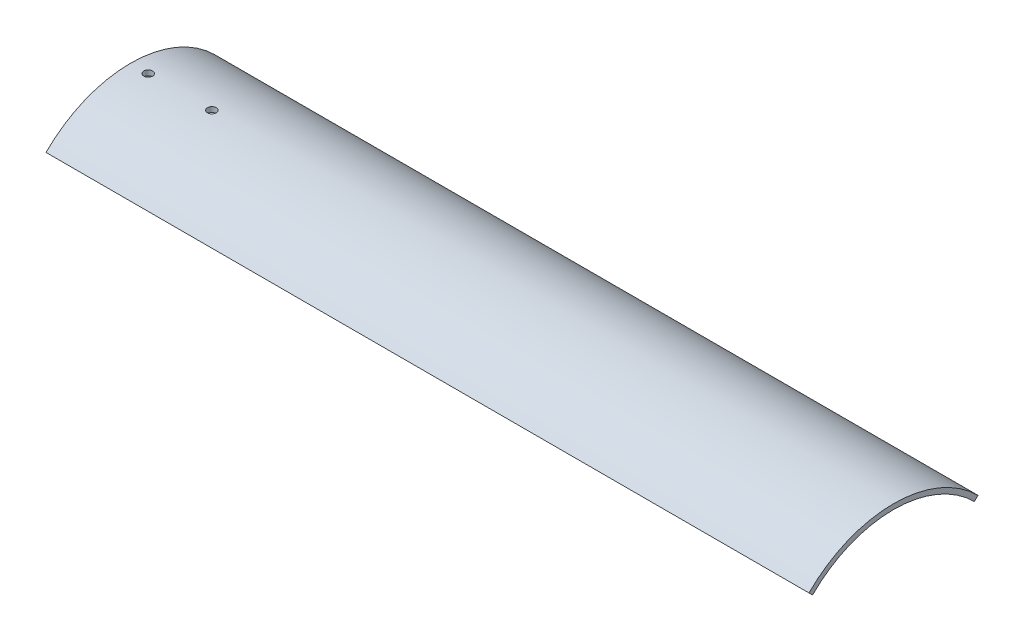
ISO-10303-21;
HEADER;
FILE_DESCRIPTION(('STEP AP214'),'2;1');
FILE_NAME('part.step','',(''),(''),'','','');
FILE_SCHEMA(('AUTOMOTIVE_DESIGN { 1 0 10303 214 1 1 1 1 }'));
ENDSEC;
DATA;
#1=APPLICATION_CONTEXT('core data for automotive mechanical design processes');
#2=APPLICATION_PROTOCOL_DEFINITION('international standard','automotive_design',2000,#1);
#3=PRODUCT_CONTEXT('',#1,'mechanical');
#4=PRODUCT('Part','Part','',(#3));
#5=PRODUCT_RELATED_PRODUCT_CATEGORY('part','',(#4));
#6=PRODUCT_DEFINITION_FORMATION('','',#4);
#7=PRODUCT_DEFINITION_CONTEXT('part definition',#1,'design');
#8=PRODUCT_DEFINITION('design','',#6,#7);
#9=PRODUCT_DEFINITION_SHAPE('','',#8);
#10=(LENGTH_UNIT() NAMED_UNIT(*) SI_UNIT(.MILLI.,.METRE.));
#11=(NAMED_UNIT(*) PLANE_ANGLE_UNIT() SI_UNIT($,.RADIAN.));
#12=(NAMED_UNIT(*) SI_UNIT($,.STERADIAN.) SOLID_ANGLE_UNIT());
#13=UNCERTAINTY_MEASURE_WITH_UNIT(LENGTH_MEASURE(1.E-05),#10,'distance_accuracy_value','');
#14=(GEOMETRIC_REPRESENTATION_CONTEXT(3) GLOBAL_UNCERTAINTY_ASSIGNED_CONTEXT((#13)) GLOBAL_UNIT_ASSIGNED_CONTEXT((#10,
#11,#12)) REPRESENTATION_CONTEXT('',''));
#15=CARTESIAN_POINT('',(0.,0.,0.));
#16=DIRECTION('',(0.,0.,1.));
#17=DIRECTION('',(1.,0.,0.));
#18=AXIS2_PLACEMENT_3D('',#15,#16,#17);
#19=CARTESIAN_POINT('',(300.,0.,0.));
#20=DIRECTION('',(-1.,0.,0.));
#21=DIRECTION('',(0.,0.,1.));
#22=AXIS2_PLACEMENT_3D('',#19,#20,#21);
#23=CYLINDRICAL_SURFACE('',#22,45.);
#24=CARTESIAN_POINT('',(0.,0.,0.));
#25=DIRECTION('',(-1.,0.,0.));
#26=DIRECTION('',(0.,0.,-1.));
#27=AXIS2_PLACEMENT_3D('',#24,#25,#26);
#28=CIRCLE('',#27,45.);
#29=CARTESIAN_POINT('',(0.,31.8198051533945,31.8198051533948));
#30=VERTEX_POINT('',#29);
#31=CARTESIAN_POINT('',(0.,31.8198051533947,-31.8198051533945));
#32=VERTEX_POINT('',#31);
#33=EDGE_CURVE('E119',#30,#32,#28,.T.);
#34=ORIENTED_EDGE('',*,*,#33,.T.);
#35=DIRECTION('',(-1.,0.,0.));
#36=VECTOR('',#35,1.);
#37=CARTESIAN_POINT('',(300.,31.8198051533947,-31.8198051533946));
#38=LINE('',#37,#36);
#39=CARTESIAN_POINT('',(300.,31.8198051533947,-31.8198051533946));
#40=VERTEX_POINT('',#39);
#41=EDGE_CURVE('E106',#40,#32,#38,.T.);
#42=ORIENTED_EDGE('',*,*,#41,.F.);
#43=CARTESIAN_POINT('',(300.,0.,0.));
#44=DIRECTION('',(-1.,0.,0.));
#45=DIRECTION('',(0.,0.,-1.));
#46=AXIS2_PLACEMENT_3D('',#43,#44,#45);
#47=CIRCLE('',#46,45.);
#48=CARTESIAN_POINT('',(300.,31.8198051533945,31.8198051533947));
#49=VERTEX_POINT('',#48);
#50=EDGE_CURVE('E98',#49,#40,#47,.T.);
#51=ORIENTED_EDGE('',*,*,#50,.F.);
#52=DIRECTION('',(-1.,0.,0.));
#53=VECTOR('',#52,1.);
#54=CARTESIAN_POINT('',(300.,31.8198051533945,31.8198051533947));
#55=LINE('',#54,#53);
#56=EDGE_CURVE('E115',#49,#30,#55,.T.);
#57=ORIENTED_EDGE('',*,*,#56,.T.);
#58=EDGE_LOOP('',(#34,#42,#51,#57));
#59=FACE_BOUND('',#58,.T.);
#60=CARTESIAN_POINT('',(6.99999999999996,44.9659593470438,-1.74999999999997));
#61=CARTESIAN_POINT('',(7.09825838396686,44.9659598055857,-1.74999565495516));
#62=CARTESIAN_POINT('',(7.19658706853365,44.9662848747568,-1.74169675016469));
#63=CARTESIAN_POINT('',(7.39053367823565,44.9675503086713,-1.7087074677497));
#64=CARTESIAN_POINT('',(7.48614824126109,44.9684914045432,-1.68399761235469));
#65=CARTESIAN_POINT('',(7.67182891684091,44.9708821261737,-1.6188933800893));
#66=CARTESIAN_POINT('',(7.7618977616683,44.9723314991183,-1.5785067996637));
#67=CARTESIAN_POINT('',(7.93395258700272,44.9755751380676,-1.48320703325454));
#68=CARTESIAN_POINT('',(8.01594050912741,44.9773693209171,-1.42829734849969));
#69=CARTESIAN_POINT('',(8.16958591821743,44.9811017963171,-1.30546822996094));
#70=CARTESIAN_POINT('',(8.24123741561034,44.9830401714436,-1.23754130582705));
#71=CARTESIAN_POINT('',(8.3721252763947,44.9868418145214,-1.0906200803457));
#72=CARTESIAN_POINT('',(8.43136114067798,44.9887050794508,-1.01162533428496));
#73=CARTESIAN_POINT('',(8.53574970957215,44.9921470324911,-0.844783350008693));
#74=CARTESIAN_POINT('',(8.58089820578592,44.993725635504,-0.756933476801994));
#75=CARTESIAN_POINT('',(8.65580329141312,44.9964195837585,-0.574893620846356));
#76=CARTESIAN_POINT('',(8.68555996347752,44.9975349314877,-0.480703672145398));
#77=CARTESIAN_POINT('',(8.7288221508429,44.999176148571,-0.288708298088724));
#78=CARTESIAN_POINT('',(8.74233595338404,44.9997023185189,-0.190904742701436));
#79=CARTESIAN_POINT('',(8.75275434973569,45.0001068825402,0.00558401250816508));
#80=CARTESIAN_POINT('',(8.74965903448749,44.9999852801603,0.104269207500209));
#81=CARTESIAN_POINT('',(8.72695398943664,44.9991082603587,0.299663812484741));
#82=CARTESIAN_POINT('',(8.70735319024055,44.99835318569,0.396374261973394));
#83=CARTESIAN_POINT('',(8.65220740164322,44.9962946961243,0.585131025563077));
#84=CARTESIAN_POINT('',(8.61666236495413,44.9949912796011,0.677177325830141));
#85=CARTESIAN_POINT('',(8.53062687022684,44.9919823862289,0.85402170462127));
#86=CARTESIAN_POINT('',(8.48013232835791,44.9902767995431,0.938817794401062));
#87=CARTESIAN_POINT('',(8.36563418381595,44.986655727893,1.0987329309039));
#88=CARTESIAN_POINT('',(8.301630525562,44.984740242065,1.17385193781021));
#89=CARTESIAN_POINT('',(8.16188045375559,44.9809136840786,1.31233262069461));
#90=CARTESIAN_POINT('',(8.08612629272578,44.9790026156825,1.37568647854551));
#91=CARTESIAN_POINT('',(7.92505287855395,44.9754016215129,1.48877827791612));
#92=CARTESIAN_POINT('',(7.83973362352616,44.973711695783,1.53851621675143));
#93=CARTESIAN_POINT('',(7.66194739804559,44.9707436413353,1.62296351740035));
#94=CARTESIAN_POINT('',(7.56948029966539,44.9694655199897,1.65767261016412));
#95=CARTESIAN_POINT('',(7.38002523408606,44.9674654970992,1.711071850518));
#96=CARTESIAN_POINT('',(7.2830372874924,44.9667435930193,1.72976207111263));
#97=CARTESIAN_POINT('',(7.08736171067596,44.9659378715661,1.75058339827295));
#98=CARTESIAN_POINT('',(6.98867523546335,44.9658536365183,1.75272534400956));
#99=CARTESIAN_POINT('',(6.79234416207666,44.9663316617354,1.74041758117208));
#100=CARTESIAN_POINT('',(6.69469956184028,44.9668939207204,1.72596790544549));
#101=CARTESIAN_POINT('',(6.50325433219873,44.968601174145,1.68089605496893));
#102=CARTESIAN_POINT('',(6.40945253817957,44.9697459905998,1.65027881967516));
#103=CARTESIAN_POINT('',(6.22831980351561,44.9724891617772,1.57374596418586));
#104=CARTESIAN_POINT('',(6.14098888527319,44.9740875180699,1.52783029102967));
#105=CARTESIAN_POINT('',(5.97522700045581,44.9775586179304,1.42197604387523));
#106=CARTESIAN_POINT('',(5.89680069427478,44.9794315040147,1.36203017669828));
#107=CARTESIAN_POINT('',(5.75112110661805,44.9832400429249,1.22982787213181));
#108=CARTESIAN_POINT('',(5.68386787004977,44.9851756960031,1.15757138526514));
#109=CARTESIAN_POINT('',(5.56240721997545,44.9888927952384,1.00275246149325));
#110=CARTESIAN_POINT('',(5.5082068000026,44.990674158403,0.92018453566584));
#111=CARTESIAN_POINT('',(5.41443813456942,44.9938807063187,0.747114418116953));
#112=CARTESIAN_POINT('',(5.37486984432861,44.9953058921599,0.65661225067865));
#113=CARTESIAN_POINT('',(5.31150089804462,44.997639047213,0.470268907124216));
#114=CARTESIAN_POINT('',(5.28769573346567,44.9985471643054,0.374429266130424));
#115=CARTESIAN_POINT('',(5.25651400471212,44.9997444102247,0.180109881536486));
#116=CARTESIAN_POINT('',(5.24913739619947,45.0000335407222,0.0816301450622629));
#117=CARTESIAN_POINT('',(5.25102268108969,44.9999602341898,-0.115104307476514));
#118=CARTESIAN_POINT('',(5.2602735804137,44.9995982276905,-0.21335912924743));
#119=CARTESIAN_POINT('',(5.29512861533844,44.9982642693349,-0.406919813624855));
#120=CARTESIAN_POINT('',(5.32073278280743,44.99729231629,-0.502225670484222));
#121=CARTESIAN_POINT('',(5.3875655997709,44.9948478934991,-0.687186142921089));
#122=CARTESIAN_POINT('',(5.42879446823192,44.9933754167387,-0.776840679279731));
#123=CARTESIAN_POINT('',(5.52570374596455,44.9900957384232,-0.947954633992117));
#124=CARTESIAN_POINT('',(5.581383662935,44.9882885482713,-1.02941433138675));
#125=CARTESIAN_POINT('',(5.70565130285219,44.9845416800131,-1.18187957188539));
#126=CARTESIAN_POINT('',(5.7742461578773,44.982601929081,-1.25287929982889));
#127=CARTESIAN_POINT('',(5.92240179084603,44.9788088573197,-1.38237577847034));
#128=CARTESIAN_POINT('',(6.00196527320123,44.9769555579572,-1.44086943658578));
#129=CARTESIAN_POINT('',(6.16984273095774,44.9735435289108,-1.54370993722767));
#130=CARTESIAN_POINT('',(6.25816336701889,44.9719850261086,-1.58804590160247));
#131=CARTESIAN_POINT('',(6.4409333974421,44.9693422336031,-1.66120798358385));
#132=CARTESIAN_POINT('',(6.53537535944727,44.9682573807495,-1.69005252929878));
#133=CARTESIAN_POINT('',(6.69200849559711,44.9669731649923,-1.72379872617649));
#134=CARTESIAN_POINT('',(6.75318378215871,44.9665946445001,-1.73361177164914));
#135=CARTESIAN_POINT('',(6.87623007977502,44.9660875911573,-1.74671377551926));
#136=CARTESIAN_POINT('',(6.93810109047884,44.9659590581805,-1.75000273720696));
#137=CARTESIAN_POINT('',(6.99999999999996,44.9659593470438,-1.74999999999997));
#138=B_SPLINE_CURVE_WITH_KNOTS('',3,(#60,#61,#62,#63,#64,#65,#66,#67,#68,#69,#70,#71,#72,#73,
#74,#75,#76,#77,#78,#79,#80,#81,#82,#83,#84,#85,#86,#87,#88,#89,#90,#91,#92,#93,#94,#95,#96,#97,
#98,#99,#100,#101,#102,#103,#104,#105,#106,#107,#108,#109,#110,#111,#112,#113,#114,#115,#116,
#117,#118,#119,#120,#121,#122,#123,#124,#125,#126,#127,#128,#129,#130,#131,#132,#133,#134,#135,
#136,#137),.UNSPECIFIED.,.T.,.F.,(4,2,2,2,2,2,2,2,2,2,2,2,2,2,2,2,2,2,2,2,2,2,2,2,2,2,2,2,2,2,2,
2,2,2,2,2,2,2,4),(0.,0.294549206850422,0.589448633456439,0.884201586393691,1.17888354498232,
1.47373558071705,1.76859946722442,2.06355135589732,2.35850166072235,2.65330141560924,
2.94809955635568,3.24273829336388,3.53737790422566,3.83209807763952,4.12681946365226,
4.42173600129815,4.71665259708723,5.01157447232258,5.30649500347181,5.60122234437536,
5.89594910178905,6.19058586736806,6.48522365294112,6.78001493870208,7.07480740927573,
7.36975747625019,7.66470664054571,7.95957140762605,8.25443537891227,8.54910445837557,
8.843774112074,9.13844789546304,9.43311164157294,9.72793859109441,10.0228383632371,
10.3179641812579,10.6127381448075,10.7982926304725,10.9838470225588),.UNSPECIFIED.);
#139=CARTESIAN_POINT('',(6.99999999999996,44.9659593470438,-1.74999999999997));
#140=VERTEX_POINT('',#139);
#141=EDGE_CURVE('E123',#140,#140,#138,.T.);
#142=ORIENTED_EDGE('',*,*,#141,.F.);
#143=EDGE_LOOP('',(#142));
#144=FACE_BOUND('',#143,.T.);
#145=CARTESIAN_POINT('',(32.,44.9659593470438,-1.74999999999999));
#146=CARTESIAN_POINT('',(32.0982583839669,44.9659598055857,-1.7499956549552));
#147=CARTESIAN_POINT('',(32.1965870685336,44.9662848747568,-1.74169675016472));
#148=CARTESIAN_POINT('',(32.3905336782356,44.9675503086713,-1.70870746774969));
#149=CARTESIAN_POINT('',(32.486148241261,44.9684914045432,-1.68399761235466));
#150=CARTESIAN_POINT('',(32.6718289168409,44.9708821261737,-1.61889338008928));
#151=CARTESIAN_POINT('',(32.7618977616683,44.9723314991183,-1.57850679966371));
#152=CARTESIAN_POINT('',(32.9339525870027,44.9755751380676,-1.48320703325458));
#153=CARTESIAN_POINT('',(33.0159405091274,44.9773693209171,-1.42829734849971));
#154=CARTESIAN_POINT('',(33.1695859182174,44.981101796317,-1.30546822996096));
#155=CARTESIAN_POINT('',(33.2412374156103,44.9830401714435,-1.23754130582709));
#156=CARTESIAN_POINT('',(33.3721252763947,44.9868418145214,-1.09062008034574));
#157=CARTESIAN_POINT('',(33.431361140678,44.9887050794508,-1.01162533428498));
#158=CARTESIAN_POINT('',(33.5357497095721,44.9921470324911,-0.844783350008705));
#159=CARTESIAN_POINT('',(33.5808982057859,44.993725635504,-0.756933476802006));
#160=CARTESIAN_POINT('',(33.6558032914132,44.9964195837585,-0.574893620846368));
#161=CARTESIAN_POINT('',(33.6855599634776,44.9975349314877,-0.48070367214541));
#162=CARTESIAN_POINT('',(33.728822150843,44.999176148571,-0.288708298088726));
#163=CARTESIAN_POINT('',(33.7423359533841,44.9997023185189,-0.190904742701431));
#164=CARTESIAN_POINT('',(33.7527543497357,45.0001068825402,0.00558401250817999));
#165=CARTESIAN_POINT('',(33.7496590344875,44.9999852801603,0.104269207500225));
#166=CARTESIAN_POINT('',(33.7269539894367,44.9991082603587,0.29966381248476));
#167=CARTESIAN_POINT('',(33.7073531902406,44.99835318569,0.396374261973414));
#168=CARTESIAN_POINT('',(33.6522074016432,44.9962946961243,0.585131025563082));
#169=CARTESIAN_POINT('',(33.6166623649541,44.9949912796011,0.677177325830131));
#170=CARTESIAN_POINT('',(33.5306268702268,44.9919823862289,0.854021704621262));
#171=CARTESIAN_POINT('',(33.4801323283579,44.9902767995431,0.938817794401072));
#172=CARTESIAN_POINT('',(33.365634183816,44.986655727893,1.09873293090394));
#173=CARTESIAN_POINT('',(33.301630525562,44.984740242065,1.17385193781026));
#174=CARTESIAN_POINT('',(33.1618804537556,44.9809136840786,1.31233262069464));
#175=CARTESIAN_POINT('',(33.0861262927258,44.9790026156825,1.37568647854553));
#176=CARTESIAN_POINT('',(32.9250528785539,44.9754016215129,1.48877827791615));
#177=CARTESIAN_POINT('',(32.8397336235262,44.9737116957831,1.53851621675148));
#178=CARTESIAN_POINT('',(32.6619473980456,44.9707436413353,1.6229635174004));
#179=CARTESIAN_POINT('',(32.5694802996654,44.9694655199897,1.65767261016415));
#180=CARTESIAN_POINT('',(32.380025234086,44.9674654970991,1.711071850518));
#181=CARTESIAN_POINT('',(32.2830372874924,44.9667435930193,1.72976207111264));
#182=CARTESIAN_POINT('',(32.087361710676,44.9659378715661,1.75058339827297));
#183=CARTESIAN_POINT('',(31.9886752354634,44.9658536365183,1.75272534400958));
#184=CARTESIAN_POINT('',(31.7923441620767,44.9663316617354,1.74041758117207));
#185=CARTESIAN_POINT('',(31.6946995618403,44.9668939207203,1.72596790544546));
#186=CARTESIAN_POINT('',(31.5032543321988,44.9686011741449,1.68089605496891));
#187=CARTESIAN_POINT('',(31.4094525381796,44.9697459905998,1.65027881967516));
#188=CARTESIAN_POINT('',(31.2283198035156,44.9724891617772,1.57374596418585));
#189=CARTESIAN_POINT('',(31.1409888852732,44.9740875180698,1.52783029102965));
#190=CARTESIAN_POINT('',(30.9752270004558,44.9775586179304,1.42197604387518));
#191=CARTESIAN_POINT('',(30.8968006942748,44.9794315040146,1.36203017669822));
#192=CARTESIAN_POINT('',(30.751121106618,44.9832400429249,1.22982787213179));
#193=CARTESIAN_POINT('',(30.6838678700497,44.9851756960031,1.15757138526516));
#194=CARTESIAN_POINT('',(30.5624072199754,44.9888927952384,1.00275246149327));
#195=CARTESIAN_POINT('',(30.5082068000026,44.990674158403,0.920184535665813));
#196=CARTESIAN_POINT('',(30.4144381345694,44.9938807063187,0.747114418116914));
#197=CARTESIAN_POINT('',(30.3748698443286,44.9953058921599,0.65661225067864));
#198=CARTESIAN_POINT('',(30.3115008980446,44.997639047213,0.47026890712424));
#199=CARTESIAN_POINT('',(30.2876957334657,44.9985471643054,0.374429266130453));
#200=CARTESIAN_POINT('',(30.2565140047122,44.9997444102247,0.180109881536538));
#201=CARTESIAN_POINT('',(30.2491373961995,45.0000335407222,0.0816301450623342));
#202=CARTESIAN_POINT('',(30.2510226810897,44.9999602341898,-0.115104307476435));
#203=CARTESIAN_POINT('',(30.2602735804137,44.9995982276905,-0.213359129247361));
#204=CARTESIAN_POINT('',(30.2951286153384,44.9982642693349,-0.40691981362481));
#205=CARTESIAN_POINT('',(30.3207327828074,44.99729231629,-0.502225670484189));
#206=CARTESIAN_POINT('',(30.3875655997709,44.9948478934991,-0.687186142921063));
#207=CARTESIAN_POINT('',(30.4287944682319,44.9933754167387,-0.7768406792797));
#208=CARTESIAN_POINT('',(30.5257037459646,44.9900957384232,-0.947954633992108));
#209=CARTESIAN_POINT('',(30.581383662935,44.9882885482713,-1.02941433138677));
#210=CARTESIAN_POINT('',(30.7056513028522,44.9845416800131,-1.1818795718854));
#211=CARTESIAN_POINT('',(30.7742461578773,44.9826019290809,-1.25287929982887));
#212=CARTESIAN_POINT('',(30.922401790846,44.9788088573197,-1.38237577847034));
#213=CARTESIAN_POINT('',(31.0019652732012,44.9769555579572,-1.44086943658584));
#214=CARTESIAN_POINT('',(31.1698427309577,44.9735435289108,-1.54370993722772));
#215=CARTESIAN_POINT('',(31.2581633670188,44.9719850261086,-1.58804590160245));
#216=CARTESIAN_POINT('',(31.440933397442,44.9693422336031,-1.66120798358381));
#217=CARTESIAN_POINT('',(31.5353753594472,44.9682573807495,-1.69005252929881));
#218=CARTESIAN_POINT('',(31.692008495597,44.9669731649923,-1.72379872617652));
#219=CARTESIAN_POINT('',(31.7531837821587,44.9665946445001,-1.73361177164913));
#220=CARTESIAN_POINT('',(31.876230079775,44.9660875911573,-1.74671377551925));
#221=CARTESIAN_POINT('',(31.9381010904788,44.9659590581805,-1.75000273720697));
#222=CARTESIAN_POINT('',(32.,44.9659593470438,-1.74999999999999));
#223=B_SPLINE_CURVE_WITH_KNOTS('',3,(#145,#146,#147,#148,#149,#150,#151,#152,#153,#154,#155,
#156,#157,#158,#159,#160,#161,#162,#163,#164,#165,#166,#167,#168,#169,#170,#171,#172,#173,#174,
#175,#176,#177,#178,#179,#180,#181,#182,#183,#184,#185,#186,#187,#188,#189,#190,#191,#192,#193,
#194,#195,#196,#197,#198,#199,#200,#201,#202,#203,#204,#205,#206,#207,#208,#209,#210,#211,#212,
#213,#214,#215,#216,#217,#218,#219,#220,#221,#222),.UNSPECIFIED.,.T.,.F.,(4,2,2,2,2,2,2,2,2,2,2,
2,2,2,2,2,2,2,2,2,2,2,2,2,2,2,2,2,2,2,2,2,2,2,2,2,2,2,4),(0.,0.2945492068504,0.589448633456409,
0.884201586393671,1.17888354498231,1.47373558071703,1.76859946722439,2.06355135589733,
2.35850166072238,2.65330141560927,2.94809955635573,3.24273829336392,3.5373779042257,
3.83209807763957,4.12681946365231,4.42173600129821,4.71665259708731,5.01157447232265,
5.30649500347187,5.60122234437539,5.89594910178905,6.1905858673681,6.4852236529412,
6.78001493870217,7.07480740927583,7.36975747625028,7.66470664054578,7.95957140762606,
8.25443537891223,8.54910445837556,8.84377411207401,9.13844789546307,9.433111641573,
9.72793859109445,10.0228383632371,10.3179641812579,10.6127381448074,10.7982926304726,
10.9838470225588),.UNSPECIFIED.);
#224=CARTESIAN_POINT('',(32.,44.9659593470438,-1.74999999999999));
#225=VERTEX_POINT('',#224);
#226=EDGE_CURVE('E160',#225,#225,#223,.T.);
#227=ORIENTED_EDGE('',*,*,#226,.F.);
#228=EDGE_LOOP('',(#227));
#229=FACE_BOUND('',#228,.T.);
#230=ADVANCED_FACE('F39',(#59,#144,#229),#23,.F.);
#231=CARTESIAN_POINT('',(300.,0.,0.));
#232=DIRECTION('',(-1.,0.,0.));
#233=DIRECTION('',(0.,0.,1.));
#234=AXIS2_PLACEMENT_3D('',#231,#232,#233);
#235=CYLINDRICAL_SURFACE('',#234,47.);
#236=CARTESIAN_POINT('',(0.,0.,0.));
#237=DIRECTION('',(1.,0.,0.));
#238=DIRECTION('',(0.,0.,-1.));
#239=AXIS2_PLACEMENT_3D('',#236,#237,#238);
#240=CIRCLE('',#239,47.);
#241=CARTESIAN_POINT('',(0.,33.2340187157679,-33.2340187157676));
#242=VERTEX_POINT('',#241);
#243=CARTESIAN_POINT('',(0.,33.2340187157676,33.2340187157678));
#244=VERTEX_POINT('',#243);
#245=EDGE_CURVE('E79',#242,#244,#240,.T.);
#246=ORIENTED_EDGE('',*,*,#245,.T.);
#247=DIRECTION('',(-1.,0.,0.));
#248=VECTOR('',#247,1.);
#249=CARTESIAN_POINT('',(300.,33.2340187157676,33.2340187157679));
#250=LINE('',#249,#248);
#251=CARTESIAN_POINT('',(300.,33.2340187157676,33.2340187157679));
#252=VERTEX_POINT('',#251);
#253=EDGE_CURVE('E107',#252,#244,#250,.T.);
#254=ORIENTED_EDGE('',*,*,#253,.F.);
#255=CARTESIAN_POINT('',(300.,0.,0.));
#256=DIRECTION('',(1.,0.,0.));
#257=DIRECTION('',(0.,0.,-1.));
#258=AXIS2_PLACEMENT_3D('',#255,#256,#257);
#259=CIRCLE('',#258,47.);
#260=CARTESIAN_POINT('',(300.,33.2340187157679,-33.2340187157676));
#261=VERTEX_POINT('',#260);
#262=EDGE_CURVE('E96',#261,#252,#259,.T.);
#263=ORIENTED_EDGE('',*,*,#262,.F.);
#264=DIRECTION('',(-1.,0.,0.));
#265=VECTOR('',#264,1.);
#266=CARTESIAN_POINT('',(300.,33.2340187157679,-33.2340187157676));
#267=LINE('',#266,#265);
#268=EDGE_CURVE('E102',#261,#242,#267,.T.);
#269=ORIENTED_EDGE('',*,*,#268,.T.);
#270=EDGE_LOOP('',(#246,#254,#263,#269));
#271=FACE_BOUND('',#270,.T.);
#272=CARTESIAN_POINT('',(5.24999999999999,47.,0.));
#273=CARTESIAN_POINT('',(5.25000434622204,46.9999995619824,0.098261733402972));
#274=CARTESIAN_POINT('',(5.25830381440445,46.9996885458717,0.19659384853529));
#275=CARTESIAN_POINT('',(5.29129546579021,46.9984777402596,0.390547455687637));
#276=CARTESIAN_POINT('',(5.31600714912193,46.9975772503948,0.486165581999669));
#277=CARTESIAN_POINT('',(5.38111652393293,46.9952894578049,0.671853405555185));
#278=CARTESIAN_POINT('',(5.42150644431951,46.9939023962871,0.761925826003187));
#279=CARTESIAN_POINT('',(5.51681437898716,46.9907978446365,0.933987090032334));
#280=CARTESIAN_POINT('',(5.5717288823833,46.989080434383,1.01597788054109));
#281=CARTESIAN_POINT('',(5.69456638508696,46.9855073091963,1.16962465367152));
#282=CARTESIAN_POINT('',(5.76249635577369,46.9836515204713,1.24127506152763));
#283=CARTESIAN_POINT('',(5.90942347649974,46.9800114417623,1.37215998313444));
#284=CARTESIAN_POINT('',(5.98842107048649,46.9782271546501,1.43139399859748));
#285=CARTESIAN_POINT('',(6.15526591067904,46.9749308445847,1.53577670373225));
#286=CARTESIAN_POINT('',(6.24311556235092,46.9734188959499,1.58092155107174));
#287=CARTESIAN_POINT('',(6.42515375161989,46.9708385476601,1.65581961557862));
#288=CARTESIAN_POINT('',(6.51934225691085,46.9697701457448,1.68557291118274));
#289=CARTESIAN_POINT('',(6.71133782968299,46.9681979668476,1.72882994626716));
#290=CARTESIAN_POINT('',(6.80914318395898,46.9676939259939,1.74234128003423));
#291=CARTESIAN_POINT('',(7.0056349954149,46.9673065112155,1.75275426617976));
#292=CARTESIAN_POINT('',(7.10432144803114,46.9674231340781,1.74965600453861));
#293=CARTESIAN_POINT('',(7.29972257174138,46.9682636498615,1.72694412093008));
#294=CARTESIAN_POINT('',(7.3964381978067,46.9689872411439,1.70733870232887));
#295=CARTESIAN_POINT('',(7.58520454073382,46.9709596530275,1.652181729797));
#296=CARTESIAN_POINT('',(7.67725524444732,46.972208475109,1.61663013092411));
#297=CARTESIAN_POINT('',(7.85410519131176,46.9750909260927,1.53058057324213));
#298=CARTESIAN_POINT('',(7.93890260612442,46.9767246516304,1.48007886018117));
#299=CARTESIAN_POINT('',(8.09881885762213,46.9801926497227,1.36556539660628));
#300=CARTESIAN_POINT('',(8.17393765813938,46.9820269230268,1.30155359560917));
#301=CARTESIAN_POINT('',(8.31241210375738,46.9856905927377,1.16179064850774));
#302=CARTESIAN_POINT('',(8.37576057371611,46.9875199855041,1.08603239309435));
#303=CARTESIAN_POINT('',(8.48884087026543,46.9909666028511,0.924952084006122));
#304=CARTESIAN_POINT('',(8.53857269435313,46.9925838273927,0.839630028573337));
#305=CARTESIAN_POINT('',(8.62300722917735,46.9954238523778,0.661840046762843));
#306=CARTESIAN_POINT('',(8.6577097066737,46.9966466467001,0.569372009513012));
#307=CARTESIAN_POINT('',(8.71109585732827,46.9985598849589,0.379916709449936));
#308=CARTESIAN_POINT('',(8.72977959727917,46.9992503311149,0.282929465482027));
#309=CARTESIAN_POINT('',(8.75058910158966,47.0000207633085,0.0872511976913105));
#310=CARTESIAN_POINT('',(8.75272479318484,47.0001011153432,-0.0114387690388344));
#311=CARTESIAN_POINT('',(8.74040345761698,46.9996432724828,-0.207775791267723));
#312=CARTESIAN_POINT('',(8.7259464605014,46.9991050787077,-0.305422848654731));
#313=CARTESIAN_POINT('',(8.68085834494503,46.9974710237197,-0.496874489184453));
#314=CARTESIAN_POINT('',(8.65023174171587,46.9963753181898,-0.590680137129165));
#315=CARTESIAN_POINT('',(8.57367837022563,46.9937496759401,-0.77181888676841));
#316=CARTESIAN_POINT('',(8.52775155369769,46.9922197378504,-0.85915196804318));
#317=CARTESIAN_POINT('',(8.42187592989655,46.9888969947222,-1.02491217901321));
#318=CARTESIAN_POINT('',(8.36192044931622,46.9871040647327,-1.10333504374235));
#319=CARTESIAN_POINT('',(8.22969919716399,46.9834577745935,-1.24900583461228));
#320=CARTESIAN_POINT('',(8.15743337974967,46.9816044142189,-1.31625371913677));
#321=CARTESIAN_POINT('',(8.00260022197434,46.9780451443569,-1.43769886609089));
#322=CARTESIAN_POINT('',(7.92002785171267,46.9763393075583,-1.49188971820358));
#323=CARTESIAN_POINT('',(7.74695108343726,46.9732685616687,-1.58563871054678));
#324=CARTESIAN_POINT('',(7.65644670838472,46.9719036515908,-1.62519689313356));
#325=CARTESIAN_POINT('',(7.47009903441605,46.9696691759186,-1.68854641165913));
#326=CARTESIAN_POINT('',(7.37425714070326,46.96879948062,-1.71234187635968));
#327=CARTESIAN_POINT('',(7.17993521589836,46.9676531306183,-1.74350401602102));
#328=CARTESIAN_POINT('',(7.08145519096543,46.9673764745307,-1.75087072933431));
#329=CARTESIAN_POINT('',(6.88471647059349,46.9674474426585,-1.74896578785017));
#330=CARTESIAN_POINT('',(6.78645767708993,46.9677946880229,-1.73970423022141));
#331=CARTESIAN_POINT('',(6.59289077320769,46.9690735180174,-1.70482645680287));
#332=CARTESIAN_POINT('',(6.49758266862023,46.9700051037941,-1.67921020891641));
#333=CARTESIAN_POINT('',(6.31261959534045,46.9723475314921,-1.61235193500865));
#334=CARTESIAN_POINT('',(6.22296470954845,46.9737583804393,-1.57110967990554));
#335=CARTESIAN_POINT('',(6.05185251976465,46.9769002421019,-1.47417263996939));
#336=CARTESIAN_POINT('',(5.97039493315318,46.9786312437734,-1.41847835363858));
#337=CARTESIAN_POINT('',(5.81794100842014,46.9822194223126,-1.29418493095391));
#338=CARTESIAN_POINT('',(5.74694992224869,46.9840766618466,-1.2255793549268));
#339=CARTESIAN_POINT('',(5.61747264812416,46.9877077650874,-1.0774038435054));
#340=CARTESIAN_POINT('',(5.558989554695,46.9894816080772,-0.997831202807279));
#341=CARTESIAN_POINT('',(5.4561732105584,46.9927467827379,-0.829939760349175));
#342=CARTESIAN_POINT('',(5.41185048567251,46.9942379039202,-0.74161451611742));
#343=CARTESIAN_POINT('',(5.33871531146055,46.9967660415875,-0.55883825115774));
#344=CARTESIAN_POINT('',(5.30988441986507,46.9978035977439,-0.464394664845234));
#345=CARTESIAN_POINT('',(5.27616809214204,46.9990312630479,-0.307797859583522));
#346=CARTESIAN_POINT('',(5.26636745978359,46.9993929570183,-0.246660454894782));
#347=CARTESIAN_POINT('',(5.25328204715142,46.999877463314,-0.123691331144124));
#348=CARTESIAN_POINT('',(5.24999726388287,47.0000002757493,-0.0618596124013411));
#349=CARTESIAN_POINT('',(5.24999999999999,47.,0.));
#350=B_SPLINE_CURVE_WITH_KNOTS('',3,(#272,#273,#274,#275,#276,#277,#278,#279,#280,#281,#282,
#283,#284,#285,#286,#287,#288,#289,#290,#291,#292,#293,#294,#295,#296,#297,#298,#299,#300,#301,
#302,#303,#304,#305,#306,#307,#308,#309,#310,#311,#312,#313,#314,#315,#316,#317,#318,#319,#320,
#321,#322,#323,#324,#325,#326,#327,#328,#329,#330,#331,#332,#333,#334,#335,#336,#337,#338,#339,
#340,#341,#342,#343,#344,#345,#346,#347,#348,#349),.UNSPECIFIED.,.T.,.F.,(4,2,2,2,2,2,2,2,2,2,2,
2,2,2,2,2,2,2,2,2,2,2,2,2,2,2,2,2,2,2,2,2,2,2,2,2,2,2,4),(0.,0.29455940006111,0.589469407672226,
0.884233426125687,1.17892625917774,1.47377737988837,1.76864033113331,2.06358362590057,
2.35852541759547,2.65332924905608,2.94813155445144,3.24278744185128,3.53744415970552,
3.83217493420352,4.12690681004231,4.42181776786774,4.71672877990125,5.01164436848952,
5.306558727374,5.60129615233234,5.89603304355613,6.19068767574977,6.48534323748528,
6.78013925015839,7.07493636064496,7.36987790746431,7.66481860052851,7.95968200857874,
8.25454472827738,8.54922845932825,8.84391276870844,9.13860139841336,9.43327986460474,
9.72810569690323,10.023004386048,10.3181217748405,10.6128870580709,10.798323830463,
10.9837605176241),.UNSPECIFIED.);
#351=CARTESIAN_POINT('',(5.24999999999999,47.,0.));
#352=VERTEX_POINT('',#351);
#353=EDGE_CURVE('E54',#352,#352,#350,.T.);
#354=ORIENTED_EDGE('',*,*,#353,.F.);
#355=EDGE_LOOP('',(#354));
#356=FACE_BOUND('',#355,.T.);
#357=CARTESIAN_POINT('',(30.25,47.,0.));
#358=CARTESIAN_POINT('',(30.250004346222,46.9999995619825,0.0982617334029944));
#359=CARTESIAN_POINT('',(30.2583038144045,46.9996885458717,0.1965938485353));
#360=CARTESIAN_POINT('',(30.2912954657902,46.9984777402595,0.390547455687631));
#361=CARTESIAN_POINT('',(30.3160071491219,46.9975772503948,0.486165581999659));
#362=CARTESIAN_POINT('',(30.3811165239329,46.9952894578049,0.671853405555164));
#363=CARTESIAN_POINT('',(30.4215064443195,46.9939023962871,0.761925826003159));
#364=CARTESIAN_POINT('',(30.5168143789872,46.9907978446365,0.933987090032307));
#365=CARTESIAN_POINT('',(30.5717288823833,46.989080434383,1.01597788054107));
#366=CARTESIAN_POINT('',(30.694566385087,46.9855073091963,1.1696246536715));
#367=CARTESIAN_POINT('',(30.7624963557737,46.9836515204713,1.24127506152761));
#368=CARTESIAN_POINT('',(30.9094234764997,46.9800114417623,1.37215998313445));
#369=CARTESIAN_POINT('',(30.9884210704865,46.9782271546501,1.43139399859753));
#370=CARTESIAN_POINT('',(31.155265910679,46.9749308445847,1.5357767037323));
#371=CARTESIAN_POINT('',(31.2431155623509,46.9734188959499,1.58092155107175));
#372=CARTESIAN_POINT('',(31.4251537516199,46.9708385476601,1.65581961557861));
#373=CARTESIAN_POINT('',(31.5193422569109,46.9697701457448,1.68557291118275));
#374=CARTESIAN_POINT('',(31.711337829683,46.9681979668476,1.72882994626719));
#375=CARTESIAN_POINT('',(31.809143183959,46.9676939259938,1.74234128003424));
#376=CARTESIAN_POINT('',(32.0056349954149,46.9673065112155,1.75275426617975));
#377=CARTESIAN_POINT('',(32.1043214480311,46.9674231340781,1.7496560045386));
#378=CARTESIAN_POINT('',(32.2997225717414,46.9682636498615,1.72694412093007));
#379=CARTESIAN_POINT('',(32.3964381978067,46.9689872411439,1.70733870232887));
#380=CARTESIAN_POINT('',(32.5852045407338,46.9709596530275,1.65218172979703));
#381=CARTESIAN_POINT('',(32.6772552444473,46.972208475109,1.61663013092417));
#382=CARTESIAN_POINT('',(32.8541051913118,46.9750909260927,1.5305805732422));
#383=CARTESIAN_POINT('',(32.9389026061244,46.9767246516304,1.4800788601812));
#384=CARTESIAN_POINT('',(33.0988188576221,46.9801926497227,1.36556539660628));
#385=CARTESIAN_POINT('',(33.1739376581394,46.9820269230268,1.30155359560918));
#386=CARTESIAN_POINT('',(33.3124121037574,46.9856905927377,1.16179064850775));
#387=CARTESIAN_POINT('',(33.3757605737162,46.9875199855041,1.08603239309436));
#388=CARTESIAN_POINT('',(33.4888408702654,46.9909666028511,0.924952084006119));
#389=CARTESIAN_POINT('',(33.5385726943531,46.9925838273927,0.839630028573323));
#390=CARTESIAN_POINT('',(33.6230072291773,46.9954238523778,0.661840046762849));
#391=CARTESIAN_POINT('',(33.6577097066737,46.9966466467001,0.569372009513048));
#392=CARTESIAN_POINT('',(33.7110958573283,46.9985598849589,0.379916709449986));
#393=CARTESIAN_POINT('',(33.729779597279,46.9992503311149,0.28292946548206));
#394=CARTESIAN_POINT('',(33.7505891015895,47.0000207633085,0.0872511976913098));
#395=CARTESIAN_POINT('',(33.7527247931848,47.0001011153432,-0.0114387690388521));
#396=CARTESIAN_POINT('',(33.740403457617,46.9996432724828,-0.207775791267777));
#397=CARTESIAN_POINT('',(33.7259464605014,46.9991050787077,-0.305422848654804));
#398=CARTESIAN_POINT('',(33.680858344945,46.9974710237197,-0.496874489184533));
#399=CARTESIAN_POINT('',(33.6502317417159,46.9963753181898,-0.590680137129234));
#400=CARTESIAN_POINT('',(33.5736783702256,46.9937496759401,-0.771818886768459));
#401=CARTESIAN_POINT('',(33.5277515536977,46.9922197378505,-0.85915196804322));
#402=CARTESIAN_POINT('',(33.4218759298965,46.9888969947222,-1.02491217901325));
#403=CARTESIAN_POINT('',(33.3619204493162,46.9871040647327,-1.10333504374241));
#404=CARTESIAN_POINT('',(33.229699197164,46.9834577745935,-1.24900583461235));
#405=CARTESIAN_POINT('',(33.1574333797496,46.9816044142189,-1.31625371913683));
#406=CARTESIAN_POINT('',(33.0026002219743,46.9780451443569,-1.43769886609094));
#407=CARTESIAN_POINT('',(32.9200278517127,46.9763393075583,-1.49188971820362));
#408=CARTESIAN_POINT('',(32.7469510834372,46.9732685616686,-1.58563871054679));
#409=CARTESIAN_POINT('',(32.6564467083847,46.9719036515908,-1.62519689313355));
#410=CARTESIAN_POINT('',(32.470099034416,46.9696691759186,-1.68854641165911));
#411=CARTESIAN_POINT('',(32.3742571407033,46.96879948062,-1.71234187635968));
#412=CARTESIAN_POINT('',(32.1799352158984,46.9676531306183,-1.74350401602104));
#413=CARTESIAN_POINT('',(32.0814551909654,46.9673764745307,-1.75087072933432));
#414=CARTESIAN_POINT('',(31.8847164705935,46.9674474426585,-1.74896578785017));
#415=CARTESIAN_POINT('',(31.7864576770899,46.9677946880229,-1.7397042302214));
#416=CARTESIAN_POINT('',(31.5928907732077,46.9690735180173,-1.70482645680287));
#417=CARTESIAN_POINT('',(31.4975826686202,46.9700051037941,-1.67921020891643));
#418=CARTESIAN_POINT('',(31.3126195953404,46.9723475314921,-1.61235193500866));
#419=CARTESIAN_POINT('',(31.2229647095484,46.9737583804393,-1.57110967990553));
#420=CARTESIAN_POINT('',(31.0518525197646,46.9769002421019,-1.47417263996937));
#421=CARTESIAN_POINT('',(30.9703949331532,46.9786312437734,-1.41847835363856));
#422=CARTESIAN_POINT('',(30.8179410084201,46.9822194223126,-1.2941849309539));
#423=CARTESIAN_POINT('',(30.7469499222487,46.9840766618466,-1.22557935492678));
#424=CARTESIAN_POINT('',(30.6174726481242,46.9877077650874,-1.07740384350538));
#425=CARTESIAN_POINT('',(30.558989554695,46.9894816080772,-0.997831202807275));
#426=CARTESIAN_POINT('',(30.4561732105584,46.9927467827378,-0.829939760349172));
#427=CARTESIAN_POINT('',(30.4118504856725,46.9942379039201,-0.741614516117407));
#428=CARTESIAN_POINT('',(30.3387153114606,46.9967660415875,-0.558838251157729));
#429=CARTESIAN_POINT('',(30.309884419865,46.997803597744,-0.464394664845236));
#430=CARTESIAN_POINT('',(30.276168092142,46.999031263048,-0.307797859583519));
#431=CARTESIAN_POINT('',(30.2663674597836,46.9993929570183,-0.246660454894769));
#432=CARTESIAN_POINT('',(30.2532820471514,46.999877463314,-0.123691331144097));
#433=CARTESIAN_POINT('',(30.2499972638829,47.0000002757493,-0.0618596124013105));
#434=CARTESIAN_POINT('',(30.25,47.,0.));
#435=B_SPLINE_CURVE_WITH_KNOTS('',3,(#357,#358,#359,#360,#361,#362,#363,#364,#365,#366,#367,
#368,#369,#370,#371,#372,#373,#374,#375,#376,#377,#378,#379,#380,#381,#382,#383,#384,#385,#386,
#387,#388,#389,#390,#391,#392,#393,#394,#395,#396,#397,#398,#399,#400,#401,#402,#403,#404,#405,
#406,#407,#408,#409,#410,#411,#412,#413,#414,#415,#416,#417,#418,#419,#420,#421,#422,#423,#424,
#425,#426,#427,#428,#429,#430,#431,#432,#433,#434),.UNSPECIFIED.,.T.,.F.,(4,2,2,2,2,2,2,2,2,2,2,
2,2,2,2,2,2,2,2,2,2,2,2,2,2,2,2,2,2,2,2,2,2,2,2,2,2,2,4),(0.,0.29455940006108,0.589469407672152,
0.884233426125629,1.17892625917772,1.47377737988834,1.76864033113326,2.06358362590054,
2.35852541759546,2.65332924905606,2.94813155445141,3.24278744185125,3.53744415970547,
3.8321749342035,4.12690681004232,4.42181776786775,4.71672877990123,5.01164436848947,
5.30655872737394,5.60129615233235,5.89603304355619,6.19068767574981,6.48534323748531,
6.78013925015845,7.07493636064502,7.36987790746432,7.6648186005285,7.95968200857873,
8.25454472827738,8.54922845932825,8.84391276870843,9.13860139841337,9.43327986460476,
9.72810569690323,10.0230043860479,10.3181217748405,10.6128870580709,10.798323830463,
10.9837605176241),.UNSPECIFIED.);
#436=CARTESIAN_POINT('',(30.25,47.,0.));
#437=VERTEX_POINT('',#436);
#438=EDGE_CURVE('E11',#437,#437,#435,.T.);
#439=ORIENTED_EDGE('',*,*,#438,.F.);
#440=EDGE_LOOP('',(#439));
#441=FACE_BOUND('',#440,.T.);
#442=ADVANCED_FACE('F109',(#271,#356,#441),#235,.T.);
#443=CARTESIAN_POINT('',(300.,31.8198051533947,-31.8198051533946));
#444=DIRECTION('',(0.,0.707106781186542,0.707106781186553));
#445=DIRECTION('',(0.,-0.707106781186553,0.707106781186542));
#446=AXIS2_PLACEMENT_3D('',#443,#444,#445);
#447=PLANE('',#446);
#448=DIRECTION('',(0.,0.707106781186553,-0.707106781186542));
#449=VECTOR('',#448,1.);
#450=CARTESIAN_POINT('',(0.,31.8198051533947,-31.8198051533945));
#451=LINE('',#450,#449);
#452=EDGE_CURVE('E104',#32,#242,#451,.T.);
#453=ORIENTED_EDGE('',*,*,#452,.T.);
#454=ORIENTED_EDGE('',*,*,#268,.F.);
#455=DIRECTION('',(0.,0.707106781186553,-0.707106781186542));
#456=VECTOR('',#455,1.);
#457=CARTESIAN_POINT('',(300.,31.8198051533947,-31.8198051533946));
#458=LINE('',#457,#456);
#459=EDGE_CURVE('E93',#40,#261,#458,.T.);
#460=ORIENTED_EDGE('',*,*,#459,.F.);
#461=ORIENTED_EDGE('',*,*,#41,.T.);
#462=EDGE_LOOP('',(#453,#454,#460,#461));
#463=FACE_BOUND('',#462,.T.);
#464=ADVANCED_FACE('F103',(#463),#447,.F.);
#465=CARTESIAN_POINT('',(300.,31.8198051533945,31.8198051533947));
#466=DIRECTION('',(0.,0.707106781186549,-0.707106781186546));
#467=DIRECTION('',(0.,0.707106781186545,0.707106781186549));
#468=AXIS2_PLACEMENT_3D('',#465,#466,#467);
#469=PLANE('',#468);
#470=DIRECTION('',(0.,-0.707106781186546,-0.707106781186549));
#471=VECTOR('',#470,1.);
#472=CARTESIAN_POINT('',(0.,31.8198051533945,31.8198051533948));
#473=LINE('',#472,#471);
#474=EDGE_CURVE('E85',#244,#30,#473,.T.);
#475=ORIENTED_EDGE('',*,*,#474,.T.);
#476=ORIENTED_EDGE('',*,*,#56,.F.);
#477=DIRECTION('',(0.,-0.707106781186546,-0.707106781186549));
#478=VECTOR('',#477,1.);
#479=CARTESIAN_POINT('',(300.,31.8198051533945,31.8198051533947));
#480=LINE('',#479,#478);
#481=EDGE_CURVE('E62',#252,#49,#480,.T.);
#482=ORIENTED_EDGE('',*,*,#481,.F.);
#483=ORIENTED_EDGE('',*,*,#253,.T.);
#484=EDGE_LOOP('',(#475,#476,#482,#483));
#485=FACE_BOUND('',#484,.T.);
#486=ADVANCED_FACE('F192',(#485),#469,.F.);
#487=CARTESIAN_POINT('',(300.,0.,0.));
#488=DIRECTION('',(1.,0.,0.));
#489=DIRECTION('',(0.,0.,-1.));
#490=AXIS2_PLACEMENT_3D('',#487,#488,#489);
#491=PLANE('',#490);
#492=ORIENTED_EDGE('',*,*,#50,.T.);
#493=ORIENTED_EDGE('',*,*,#459,.T.);
#494=ORIENTED_EDGE('',*,*,#262,.T.);
#495=ORIENTED_EDGE('',*,*,#481,.T.);
#496=EDGE_LOOP('',(#492,#493,#494,#495));
#497=FACE_BOUND('',#496,.T.);
#498=ADVANCED_FACE('F94',(#497),#491,.T.);
#499=CARTESIAN_POINT('',(0.,0.,0.));
#500=DIRECTION('',(1.,0.,0.));
#501=DIRECTION('',(0.,0.,-1.));
#502=AXIS2_PLACEMENT_3D('',#499,#500,#501);
#503=PLANE('',#502);
#504=ORIENTED_EDGE('',*,*,#33,.F.);
#505=ORIENTED_EDGE('',*,*,#474,.F.);
#506=ORIENTED_EDGE('',*,*,#245,.F.);
#507=ORIENTED_EDGE('',*,*,#452,.F.);
#508=EDGE_LOOP('',(#504,#505,#506,#507));
#509=FACE_BOUND('',#508,.T.);
#510=ADVANCED_FACE('F148',(#509),#503,.F.);
#511=CARTESIAN_POINT('',(7.00000000000001,47.,0.));
#512=DIRECTION('',(0.,-1.,0.));
#513=DIRECTION('',(0.,0.,-1.));
#514=AXIS2_PLACEMENT_3D('',#511,#512,#513);
#515=CYLINDRICAL_SURFACE('',#514,1.75);
#516=ORIENTED_EDGE('',*,*,#353,.T.);
#517=EDGE_LOOP('',(#516));
#518=FACE_BOUND('',#517,.T.);
#519=ORIENTED_EDGE('',*,*,#141,.T.);
#520=EDGE_LOOP('',(#519));
#521=FACE_BOUND('',#520,.T.);
#522=ADVANCED_FACE('F143',(#518,#521),#515,.F.);
#523=CARTESIAN_POINT('',(32.,47.,0.));
#524=DIRECTION('',(0.,-1.,0.));
#525=DIRECTION('',(0.,0.,-1.));
#526=AXIS2_PLACEMENT_3D('',#523,#524,#525);
#527=CYLINDRICAL_SURFACE('',#526,1.75);
#528=ORIENTED_EDGE('',*,*,#438,.T.);
#529=EDGE_LOOP('',(#528));
#530=FACE_BOUND('',#529,.T.);
#531=ORIENTED_EDGE('',*,*,#226,.T.);
#532=EDGE_LOOP('',(#531));
#533=FACE_BOUND('',#532,.T.);
#534=ADVANCED_FACE('F147',(#530,#533),#527,.F.);
#535=CLOSED_SHELL('',(#230,#442,#464,#486,#498,#510,#522,#534));
#536=MANIFOLD_SOLID_BREP('B2',#535);
#537=ADVANCED_BREP_SHAPE_REPRESENTATION('',(#18,#536),#14);
#538=SHAPE_DEFINITION_REPRESENTATION(#9,#537);
ENDSEC;
END-ISO-10303-21;
